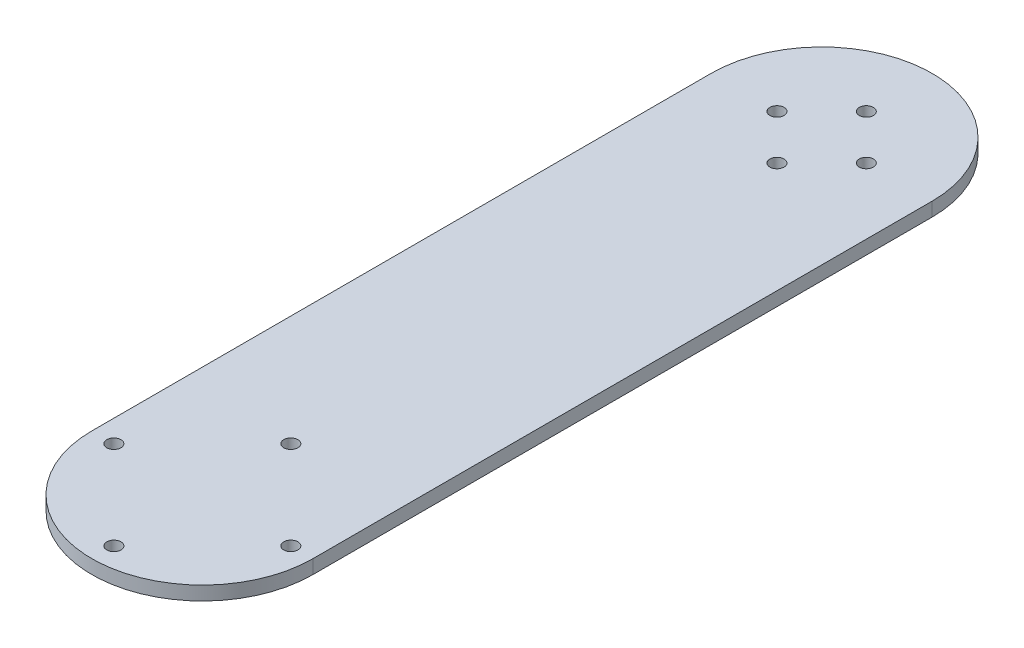
ISO-10303-21;
HEADER;
FILE_DESCRIPTION(('STEP AP214'),'2;1');
FILE_NAME('part.step','',(''),(''),'','','');
FILE_SCHEMA(('AUTOMOTIVE_DESIGN { 1 0 10303 214 1 1 1 1 }'));
ENDSEC;
DATA;
#1=APPLICATION_CONTEXT('core data for automotive mechanical design processes');
#2=APPLICATION_PROTOCOL_DEFINITION('international standard','automotive_design',2000,#1);
#3=PRODUCT_CONTEXT('',#1,'mechanical');
#4=PRODUCT('Part','Part','',(#3));
#5=PRODUCT_RELATED_PRODUCT_CATEGORY('part','',(#4));
#6=PRODUCT_DEFINITION_FORMATION('','',#4);
#7=PRODUCT_DEFINITION_CONTEXT('part definition',#1,'design');
#8=PRODUCT_DEFINITION('design','',#6,#7);
#9=PRODUCT_DEFINITION_SHAPE('','',#8);
#10=(LENGTH_UNIT() NAMED_UNIT(*) SI_UNIT(.MILLI.,.METRE.));
#11=(NAMED_UNIT(*) PLANE_ANGLE_UNIT() SI_UNIT($,.RADIAN.));
#12=(NAMED_UNIT(*) SI_UNIT($,.STERADIAN.) SOLID_ANGLE_UNIT());
#13=UNCERTAINTY_MEASURE_WITH_UNIT(LENGTH_MEASURE(1.E-05),#10,'distance_accuracy_value','');
#14=(GEOMETRIC_REPRESENTATION_CONTEXT(3) GLOBAL_UNCERTAINTY_ASSIGNED_CONTEXT((#13)) GLOBAL_UNIT_ASSIGNED_CONTEXT((#10,
#11,#12)) REPRESENTATION_CONTEXT('',''));
#15=CARTESIAN_POINT('',(0.,0.,0.));
#16=DIRECTION('',(0.,0.,1.));
#17=DIRECTION('',(1.,0.,0.));
#18=AXIS2_PLACEMENT_3D('',#15,#16,#17);
#19=CARTESIAN_POINT('',(0.,-3.125,0.));
#20=DIRECTION('',(0.,1.,0.));
#21=DIRECTION('',(0.,0.,1.));
#22=AXIS2_PLACEMENT_3D('',#19,#20,#21);
#23=CYLINDRICAL_SURFACE('',#22,25.);
#24=CARTESIAN_POINT('',(0.,0.,0.));
#25=DIRECTION('',(0.,1.,0.));
#26=DIRECTION('',(0.,0.,1.));
#27=AXIS2_PLACEMENT_3D('',#24,#25,#26);
#28=CIRCLE('',#27,25.);
#29=CARTESIAN_POINT('',(25.,0.,0.));
#30=VERTEX_POINT('',#29);
#31=CARTESIAN_POINT('',(-25.,0.,0.));
#32=VERTEX_POINT('',#31);
#33=EDGE_CURVE('E110',#30,#32,#28,.T.);
#34=ORIENTED_EDGE('',*,*,#33,.F.);
#35=DIRECTION('',(0.,1.,0.));
#36=VECTOR('',#35,1.);
#37=CARTESIAN_POINT('',(25.,-3.125,0.));
#38=LINE('',#37,#36);
#39=CARTESIAN_POINT('',(25.,-3.125,0.));
#40=VERTEX_POINT('',#39);
#41=EDGE_CURVE('E11',#40,#30,#38,.T.);
#42=ORIENTED_EDGE('',*,*,#41,.F.);
#43=CARTESIAN_POINT('',(0.,-3.125,0.));
#44=DIRECTION('',(0.,1.,0.));
#45=DIRECTION('',(0.,0.,1.));
#46=AXIS2_PLACEMENT_3D('',#43,#44,#45);
#47=CIRCLE('',#46,25.);
#48=CARTESIAN_POINT('',(-25.,-3.125,0.));
#49=VERTEX_POINT('',#48);
#50=EDGE_CURVE('E103',#40,#49,#47,.T.);
#51=ORIENTED_EDGE('',*,*,#50,.T.);
#52=DIRECTION('',(0.,1.,0.));
#53=VECTOR('',#52,1.);
#54=CARTESIAN_POINT('',(-25.,-3.125,0.));
#55=LINE('',#54,#53);
#56=EDGE_CURVE('E48',#49,#32,#55,.T.);
#57=ORIENTED_EDGE('',*,*,#56,.T.);
#58=EDGE_LOOP('',(#34,#42,#51,#57));
#59=FACE_BOUND('',#58,.T.);
#60=ADVANCED_FACE('F45',(#59),#23,.T.);
#61=CARTESIAN_POINT('',(25.,-3.125,0.));
#62=DIRECTION('',(1.,0.,0.));
#63=DIRECTION('',(0.,0.,-1.));
#64=AXIS2_PLACEMENT_3D('',#61,#62,#63);
#65=PLANE('',#64);
#66=DIRECTION('',(0.,0.,-1.));
#67=VECTOR('',#66,1.);
#68=CARTESIAN_POINT('',(25.,0.,0.));
#69=LINE('',#68,#67);
#70=CARTESIAN_POINT('',(25.,0.,140.));
#71=VERTEX_POINT('',#70);
#72=EDGE_CURVE('E105',#71,#30,#69,.T.);
#73=ORIENTED_EDGE('',*,*,#72,.F.);
#74=DIRECTION('',(0.,1.,0.));
#75=VECTOR('',#74,1.);
#76=CARTESIAN_POINT('',(25.,-3.125,140.));
#77=LINE('',#76,#75);
#78=CARTESIAN_POINT('',(25.,-3.125,140.));
#79=VERTEX_POINT('',#78);
#80=EDGE_CURVE('E54',#79,#71,#77,.T.);
#81=ORIENTED_EDGE('',*,*,#80,.F.);
#82=DIRECTION('',(0.,0.,-1.));
#83=VECTOR('',#82,1.);
#84=CARTESIAN_POINT('',(25.,-3.125,0.));
#85=LINE('',#84,#83);
#86=EDGE_CURVE('E100',#79,#40,#85,.T.);
#87=ORIENTED_EDGE('',*,*,#86,.T.);
#88=ORIENTED_EDGE('',*,*,#41,.T.);
#89=EDGE_LOOP('',(#73,#81,#87,#88));
#90=FACE_BOUND('',#89,.T.);
#91=ADVANCED_FACE('F121',(#90),#65,.T.);
#92=CARTESIAN_POINT('',(0.,-3.125,140.));
#93=DIRECTION('',(0.,1.,0.));
#94=DIRECTION('',(0.,0.,1.));
#95=AXIS2_PLACEMENT_3D('',#92,#93,#94);
#96=CYLINDRICAL_SURFACE('',#95,25.);
#97=CARTESIAN_POINT('',(0.,0.,140.));
#98=DIRECTION('',(0.,1.,0.));
#99=DIRECTION('',(0.,0.,1.));
#100=AXIS2_PLACEMENT_3D('',#97,#98,#99);
#101=CIRCLE('',#100,25.);
#102=CARTESIAN_POINT('',(-25.,0.,140.));
#103=VERTEX_POINT('',#102);
#104=EDGE_CURVE('E95',#103,#71,#101,.T.);
#105=ORIENTED_EDGE('',*,*,#104,.F.);
#106=DIRECTION('',(0.,1.,0.));
#107=VECTOR('',#106,1.);
#108=CARTESIAN_POINT('',(-25.,-3.125,140.));
#109=LINE('',#108,#107);
#110=CARTESIAN_POINT('',(-25.,-3.125,140.));
#111=VERTEX_POINT('',#110);
#112=EDGE_CURVE('E90',#111,#103,#109,.T.);
#113=ORIENTED_EDGE('',*,*,#112,.F.);
#114=CARTESIAN_POINT('',(0.,-3.125,140.));
#115=DIRECTION('',(0.,1.,0.));
#116=DIRECTION('',(0.,0.,1.));
#117=AXIS2_PLACEMENT_3D('',#114,#115,#116);
#118=CIRCLE('',#117,25.);
#119=EDGE_CURVE('E93',#111,#79,#118,.T.);
#120=ORIENTED_EDGE('',*,*,#119,.T.);
#121=ORIENTED_EDGE('',*,*,#80,.T.);
#122=EDGE_LOOP('',(#105,#113,#120,#121));
#123=FACE_BOUND('',#122,.T.);
#124=ADVANCED_FACE('F92',(#123),#96,.T.);
#125=CARTESIAN_POINT('',(-25.,-3.125,0.));
#126=DIRECTION('',(-1.,0.,0.));
#127=DIRECTION('',(0.,0.,1.));
#128=AXIS2_PLACEMENT_3D('',#125,#126,#127);
#129=PLANE('',#128);
#130=DIRECTION('',(0.,0.,1.));
#131=VECTOR('',#130,1.);
#132=CARTESIAN_POINT('',(-25.,0.,0.));
#133=LINE('',#132,#131);
#134=EDGE_CURVE('E113',#32,#103,#133,.T.);
#135=ORIENTED_EDGE('',*,*,#134,.F.);
#136=ORIENTED_EDGE('',*,*,#56,.F.);
#137=DIRECTION('',(0.,0.,1.));
#138=VECTOR('',#137,1.);
#139=CARTESIAN_POINT('',(-25.,-3.125,0.));
#140=LINE('',#139,#138);
#141=EDGE_CURVE('E99',#49,#111,#140,.T.);
#142=ORIENTED_EDGE('',*,*,#141,.T.);
#143=ORIENTED_EDGE('',*,*,#112,.T.);
#144=EDGE_LOOP('',(#135,#136,#142,#143));
#145=FACE_BOUND('',#144,.T.);
#146=ADVANCED_FACE('F102',(#145),#129,.T.);
#147=CARTESIAN_POINT('',(0.,-3.125,0.));
#148=DIRECTION('',(0.,1.,0.));
#149=DIRECTION('',(0.,0.,1.));
#150=AXIS2_PLACEMENT_3D('',#147,#148,#149);
#151=PLANE('',#150);
#152=CARTESIAN_POINT('',(0.,-3.125,120.));
#153=DIRECTION('',(0.,1.,0.));
#154=DIRECTION('',(0.,0.,1.));
#155=AXIS2_PLACEMENT_3D('',#152,#153,#154);
#156=CIRCLE('',#155,1.6);
#157=CARTESIAN_POINT('',(0.,-3.125,121.6));
#158=VERTEX_POINT('',#157);
#159=EDGE_CURVE('E178',#158,#158,#156,.T.);
#160=ORIENTED_EDGE('',*,*,#159,.T.);
#161=EDGE_LOOP('',(#160));
#162=FACE_BOUND('',#161,.T.);
#163=CARTESIAN_POINT('',(-20.,-3.125,140.));
#164=DIRECTION('',(0.,1.,0.));
#165=DIRECTION('',(0.,0.,1.));
#166=AXIS2_PLACEMENT_3D('',#163,#164,#165);
#167=CIRCLE('',#166,1.6);
#168=CARTESIAN_POINT('',(-20.,-3.125,141.6));
#169=VERTEX_POINT('',#168);
#170=EDGE_CURVE('E187',#169,#169,#167,.T.);
#171=ORIENTED_EDGE('',*,*,#170,.T.);
#172=EDGE_LOOP('',(#171));
#173=FACE_BOUND('',#172,.T.);
#174=CARTESIAN_POINT('',(0.,-3.125,160.));
#175=DIRECTION('',(0.,1.,0.));
#176=DIRECTION('',(0.,0.,1.));
#177=AXIS2_PLACEMENT_3D('',#174,#175,#176);
#178=CIRCLE('',#177,1.6);
#179=CARTESIAN_POINT('',(0.,-3.125,161.6));
#180=VERTEX_POINT('',#179);
#181=EDGE_CURVE('E195',#180,#180,#178,.T.);
#182=ORIENTED_EDGE('',*,*,#181,.T.);
#183=EDGE_LOOP('',(#182));
#184=FACE_BOUND('',#183,.T.);
#185=CARTESIAN_POINT('',(20.,-3.125,140.));
#186=DIRECTION('',(0.,1.,0.));
#187=DIRECTION('',(0.,0.,1.));
#188=AXIS2_PLACEMENT_3D('',#185,#186,#187);
#189=CIRCLE('',#188,1.6);
#190=CARTESIAN_POINT('',(20.,-3.125,141.6));
#191=VERTEX_POINT('',#190);
#192=EDGE_CURVE('E201',#191,#191,#189,.T.);
#193=ORIENTED_EDGE('',*,*,#192,.T.);
#194=EDGE_LOOP('',(#193));
#195=FACE_BOUND('',#194,.T.);
#196=CARTESIAN_POINT('',(0.,-3.125,-10.0985931710275));
#197=DIRECTION('',(0.,-1.,0.));
#198=DIRECTION('',(0.,0.,-1.));
#199=AXIS2_PLACEMENT_3D('',#196,#197,#198);
#200=CIRCLE('',#199,1.6);
#201=CARTESIAN_POINT('',(0.,-3.125,-11.6985931710275));
#202=VERTEX_POINT('',#201);
#203=EDGE_CURVE('E206',#202,#202,#200,.T.);
#204=ORIENTED_EDGE('',*,*,#203,.F.);
#205=EDGE_LOOP('',(#204));
#206=FACE_BOUND('',#205,.T.);
#207=CARTESIAN_POINT('',(10.0985931710275,-3.125,0.));
#208=DIRECTION('',(0.,-1.,0.));
#209=DIRECTION('',(0.,0.,-1.));
#210=AXIS2_PLACEMENT_3D('',#207,#208,#209);
#211=CIRCLE('',#210,1.6);
#212=CARTESIAN_POINT('',(10.0985931710275,-3.125,-1.60000000000005));
#213=VERTEX_POINT('',#212);
#214=EDGE_CURVE('E209',#213,#213,#211,.T.);
#215=ORIENTED_EDGE('',*,*,#214,.F.);
#216=EDGE_LOOP('',(#215));
#217=FACE_BOUND('',#216,.T.);
#218=CARTESIAN_POINT('',(-10.0985931710274,-3.125,0.));
#219=DIRECTION('',(0.,-1.,0.));
#220=DIRECTION('',(0.,0.,-1.));
#221=AXIS2_PLACEMENT_3D('',#218,#219,#220);
#222=CIRCLE('',#221,1.6);
#223=CARTESIAN_POINT('',(-10.0985931710274,-3.125,-1.60000000000005));
#224=VERTEX_POINT('',#223);
#225=EDGE_CURVE('E215',#224,#224,#222,.T.);
#226=ORIENTED_EDGE('',*,*,#225,.F.);
#227=EDGE_LOOP('',(#226));
#228=FACE_BOUND('',#227,.T.);
#229=CARTESIAN_POINT('',(0.,-3.125,10.0985931710274));
#230=DIRECTION('',(0.,-1.,0.));
#231=DIRECTION('',(0.,0.,-1.));
#232=AXIS2_PLACEMENT_3D('',#229,#230,#231);
#233=CIRCLE('',#232,1.6);
#234=CARTESIAN_POINT('',(0.,-3.125,8.4985931710274));
#235=VERTEX_POINT('',#234);
#236=EDGE_CURVE('E221',#235,#235,#233,.T.);
#237=ORIENTED_EDGE('',*,*,#236,.F.);
#238=EDGE_LOOP('',(#237));
#239=FACE_BOUND('',#238,.T.);
#240=ORIENTED_EDGE('',*,*,#50,.F.);
#241=ORIENTED_EDGE('',*,*,#86,.F.);
#242=ORIENTED_EDGE('',*,*,#119,.F.);
#243=ORIENTED_EDGE('',*,*,#141,.F.);
#244=EDGE_LOOP('',(#240,#241,#242,#243));
#245=FACE_BOUND('',#244,.T.);
#246=ADVANCED_FACE('F98',(#162,#173,#184,#195,#206,#217,#228,#239,#245),#151,.F.);
#247=CARTESIAN_POINT('',(0.,0.,0.));
#248=DIRECTION('',(0.,1.,0.));
#249=DIRECTION('',(0.,0.,1.));
#250=AXIS2_PLACEMENT_3D('',#247,#248,#249);
#251=PLANE('',#250);
#252=CARTESIAN_POINT('',(0.,0.,120.));
#253=DIRECTION('',(0.,1.,0.));
#254=DIRECTION('',(0.,0.,1.));
#255=AXIS2_PLACEMENT_3D('',#252,#253,#254);
#256=CIRCLE('',#255,1.6);
#257=CARTESIAN_POINT('',(0.,0.,121.6));
#258=VERTEX_POINT('',#257);
#259=EDGE_CURVE('E181',#258,#258,#256,.T.);
#260=ORIENTED_EDGE('',*,*,#259,.F.);
#261=EDGE_LOOP('',(#260));
#262=FACE_BOUND('',#261,.T.);
#263=CARTESIAN_POINT('',(-20.,0.,140.));
#264=DIRECTION('',(0.,1.,0.));
#265=DIRECTION('',(0.,0.,1.));
#266=AXIS2_PLACEMENT_3D('',#263,#264,#265);
#267=CIRCLE('',#266,1.6);
#268=CARTESIAN_POINT('',(-20.,0.,141.6));
#269=VERTEX_POINT('',#268);
#270=EDGE_CURVE('E182',#269,#269,#267,.T.);
#271=ORIENTED_EDGE('',*,*,#270,.F.);
#272=EDGE_LOOP('',(#271));
#273=FACE_BOUND('',#272,.T.);
#274=CARTESIAN_POINT('',(0.,0.,160.));
#275=DIRECTION('',(0.,1.,0.));
#276=DIRECTION('',(0.,0.,1.));
#277=AXIS2_PLACEMENT_3D('',#274,#275,#276);
#278=CIRCLE('',#277,1.6);
#279=CARTESIAN_POINT('',(0.,0.,161.6));
#280=VERTEX_POINT('',#279);
#281=EDGE_CURVE('E192',#280,#280,#278,.T.);
#282=ORIENTED_EDGE('',*,*,#281,.F.);
#283=EDGE_LOOP('',(#282));
#284=FACE_BOUND('',#283,.T.);
#285=CARTESIAN_POINT('',(20.,0.,140.));
#286=DIRECTION('',(0.,1.,0.));
#287=DIRECTION('',(0.,0.,1.));
#288=AXIS2_PLACEMENT_3D('',#285,#286,#287);
#289=CIRCLE('',#288,1.6);
#290=CARTESIAN_POINT('',(20.,0.,141.6));
#291=VERTEX_POINT('',#290);
#292=EDGE_CURVE('E198',#291,#291,#289,.T.);
#293=ORIENTED_EDGE('',*,*,#292,.F.);
#294=EDGE_LOOP('',(#293));
#295=FACE_BOUND('',#294,.T.);
#296=CARTESIAN_POINT('',(0.,0.,-10.0985931710275));
#297=DIRECTION('',(0.,-1.,0.));
#298=DIRECTION('',(0.,0.,-1.));
#299=AXIS2_PLACEMENT_3D('',#296,#297,#298);
#300=CIRCLE('',#299,1.6);
#301=CARTESIAN_POINT('',(0.,0.,-11.6985931710275));
#302=VERTEX_POINT('',#301);
#303=EDGE_CURVE('E114',#302,#302,#300,.T.);
#304=ORIENTED_EDGE('',*,*,#303,.T.);
#305=EDGE_LOOP('',(#304));
#306=FACE_BOUND('',#305,.T.);
#307=CARTESIAN_POINT('',(10.0985931710275,0.,0.));
#308=DIRECTION('',(0.,-1.,0.));
#309=DIRECTION('',(0.,0.,-1.));
#310=AXIS2_PLACEMENT_3D('',#307,#308,#309);
#311=CIRCLE('',#310,1.6);
#312=CARTESIAN_POINT('',(10.0985931710275,0.,-1.60000000000005));
#313=VERTEX_POINT('',#312);
#314=EDGE_CURVE('E212',#313,#313,#311,.T.);
#315=ORIENTED_EDGE('',*,*,#314,.T.);
#316=EDGE_LOOP('',(#315));
#317=FACE_BOUND('',#316,.T.);
#318=CARTESIAN_POINT('',(-10.0985931710274,0.,0.));
#319=DIRECTION('',(0.,-1.,0.));
#320=DIRECTION('',(0.,0.,-1.));
#321=AXIS2_PLACEMENT_3D('',#318,#319,#320);
#322=CIRCLE('',#321,1.6);
#323=CARTESIAN_POINT('',(-10.0985931710274,0.,-1.60000000000005));
#324=VERTEX_POINT('',#323);
#325=EDGE_CURVE('E218',#324,#324,#322,.T.);
#326=ORIENTED_EDGE('',*,*,#325,.T.);
#327=EDGE_LOOP('',(#326));
#328=FACE_BOUND('',#327,.T.);
#329=CARTESIAN_POINT('',(0.,0.,10.0985931710274));
#330=DIRECTION('',(0.,-1.,0.));
#331=DIRECTION('',(0.,0.,-1.));
#332=AXIS2_PLACEMENT_3D('',#329,#330,#331);
#333=CIRCLE('',#332,1.6);
#334=CARTESIAN_POINT('',(0.,0.,8.4985931710274));
#335=VERTEX_POINT('',#334);
#336=EDGE_CURVE('E184',#335,#335,#333,.T.);
#337=ORIENTED_EDGE('',*,*,#336,.T.);
#338=EDGE_LOOP('',(#337));
#339=FACE_BOUND('',#338,.T.);
#340=ORIENTED_EDGE('',*,*,#33,.T.);
#341=ORIENTED_EDGE('',*,*,#134,.T.);
#342=ORIENTED_EDGE('',*,*,#104,.T.);
#343=ORIENTED_EDGE('',*,*,#72,.T.);
#344=EDGE_LOOP('',(#340,#341,#342,#343));
#345=FACE_BOUND('',#344,.T.);
#346=ADVANCED_FACE('F120',(#262,#273,#284,#295,#306,#317,#328,#339,#345),#251,.T.);
#347=CARTESIAN_POINT('',(0.,0.,10.0985931710274));
#348=DIRECTION('',(0.,-1.,0.));
#349=DIRECTION('',(0.,0.,-1.));
#350=AXIS2_PLACEMENT_3D('',#347,#348,#349);
#351=CYLINDRICAL_SURFACE('',#350,1.6);
#352=ORIENTED_EDGE('',*,*,#336,.F.);
#353=EDGE_LOOP('',(#352));
#354=FACE_BOUND('',#353,.T.);
#355=ORIENTED_EDGE('',*,*,#236,.T.);
#356=EDGE_LOOP('',(#355));
#357=FACE_BOUND('',#356,.T.);
#358=ADVANCED_FACE('F141',(#354,#357),#351,.F.);
#359=CARTESIAN_POINT('',(-10.0985931710274,0.,0.));
#360=DIRECTION('',(0.,-1.,0.));
#361=DIRECTION('',(0.,0.,-1.));
#362=AXIS2_PLACEMENT_3D('',#359,#360,#361);
#363=CYLINDRICAL_SURFACE('',#362,1.6);
#364=ORIENTED_EDGE('',*,*,#325,.F.);
#365=EDGE_LOOP('',(#364));
#366=FACE_BOUND('',#365,.T.);
#367=ORIENTED_EDGE('',*,*,#225,.T.);
#368=EDGE_LOOP('',(#367));
#369=FACE_BOUND('',#368,.T.);
#370=ADVANCED_FACE('F147',(#366,#369),#363,.F.);
#371=CARTESIAN_POINT('',(10.0985931710275,0.,0.));
#372=DIRECTION('',(0.,-1.,0.));
#373=DIRECTION('',(0.,0.,-1.));
#374=AXIS2_PLACEMENT_3D('',#371,#372,#373);
#375=CYLINDRICAL_SURFACE('',#374,1.6);
#376=ORIENTED_EDGE('',*,*,#314,.F.);
#377=EDGE_LOOP('',(#376));
#378=FACE_BOUND('',#377,.T.);
#379=ORIENTED_EDGE('',*,*,#214,.T.);
#380=EDGE_LOOP('',(#379));
#381=FACE_BOUND('',#380,.T.);
#382=ADVANCED_FACE('F151',(#378,#381),#375,.F.);
#383=CARTESIAN_POINT('',(0.,0.,-10.0985931710275));
#384=DIRECTION('',(0.,-1.,0.));
#385=DIRECTION('',(0.,0.,-1.));
#386=AXIS2_PLACEMENT_3D('',#383,#384,#385);
#387=CYLINDRICAL_SURFACE('',#386,1.6);
#388=ORIENTED_EDGE('',*,*,#303,.F.);
#389=EDGE_LOOP('',(#388));
#390=FACE_BOUND('',#389,.T.);
#391=ORIENTED_EDGE('',*,*,#203,.T.);
#392=EDGE_LOOP('',(#391));
#393=FACE_BOUND('',#392,.T.);
#394=ADVANCED_FACE('F155',(#390,#393),#387,.F.);
#395=CARTESIAN_POINT('',(20.,-3.125,140.));
#396=DIRECTION('',(0.,1.,0.));
#397=DIRECTION('',(0.,0.,1.));
#398=AXIS2_PLACEMENT_3D('',#395,#396,#397);
#399=CYLINDRICAL_SURFACE('',#398,1.6);
#400=ORIENTED_EDGE('',*,*,#192,.F.);
#401=EDGE_LOOP('',(#400));
#402=FACE_BOUND('',#401,.T.);
#403=ORIENTED_EDGE('',*,*,#292,.T.);
#404=EDGE_LOOP('',(#403));
#405=FACE_BOUND('',#404,.T.);
#406=ADVANCED_FACE('F158',(#402,#405),#399,.F.);
#407=CARTESIAN_POINT('',(0.,-3.125,160.));
#408=DIRECTION('',(0.,1.,0.));
#409=DIRECTION('',(0.,0.,1.));
#410=AXIS2_PLACEMENT_3D('',#407,#408,#409);
#411=CYLINDRICAL_SURFACE('',#410,1.6);
#412=ORIENTED_EDGE('',*,*,#181,.F.);
#413=EDGE_LOOP('',(#412));
#414=FACE_BOUND('',#413,.T.);
#415=ORIENTED_EDGE('',*,*,#281,.T.);
#416=EDGE_LOOP('',(#415));
#417=FACE_BOUND('',#416,.T.);
#418=ADVANCED_FACE('F162',(#414,#417),#411,.F.);
#419=CARTESIAN_POINT('',(-20.,-3.125,140.));
#420=DIRECTION('',(0.,1.,0.));
#421=DIRECTION('',(0.,0.,1.));
#422=AXIS2_PLACEMENT_3D('',#419,#420,#421);
#423=CYLINDRICAL_SURFACE('',#422,1.6);
#424=ORIENTED_EDGE('',*,*,#170,.F.);
#425=EDGE_LOOP('',(#424));
#426=FACE_BOUND('',#425,.T.);
#427=ORIENTED_EDGE('',*,*,#270,.T.);
#428=EDGE_LOOP('',(#427));
#429=FACE_BOUND('',#428,.T.);
#430=ADVANCED_FACE('F166',(#426,#429),#423,.F.);
#431=CARTESIAN_POINT('',(0.,-3.125,120.));
#432=DIRECTION('',(0.,1.,0.));
#433=DIRECTION('',(0.,0.,1.));
#434=AXIS2_PLACEMENT_3D('',#431,#432,#433);
#435=CYLINDRICAL_SURFACE('',#434,1.6);
#436=ORIENTED_EDGE('',*,*,#159,.F.);
#437=EDGE_LOOP('',(#436));
#438=FACE_BOUND('',#437,.T.);
#439=ORIENTED_EDGE('',*,*,#259,.T.);
#440=EDGE_LOOP('',(#439));
#441=FACE_BOUND('',#440,.T.);
#442=ADVANCED_FACE('F170',(#438,#441),#435,.F.);
#443=CLOSED_SHELL('',(#60,#91,#124,#146,#246,#346,#358,#370,#382,#394,#406,#418,#430,#442));
#444=MANIFOLD_SOLID_BREP('B2',#443);
#445=ADVANCED_BREP_SHAPE_REPRESENTATION('',(#18,#444),#14);
#446=SHAPE_DEFINITION_REPRESENTATION(#9,#445);
ENDSEC;
END-ISO-10303-21;
